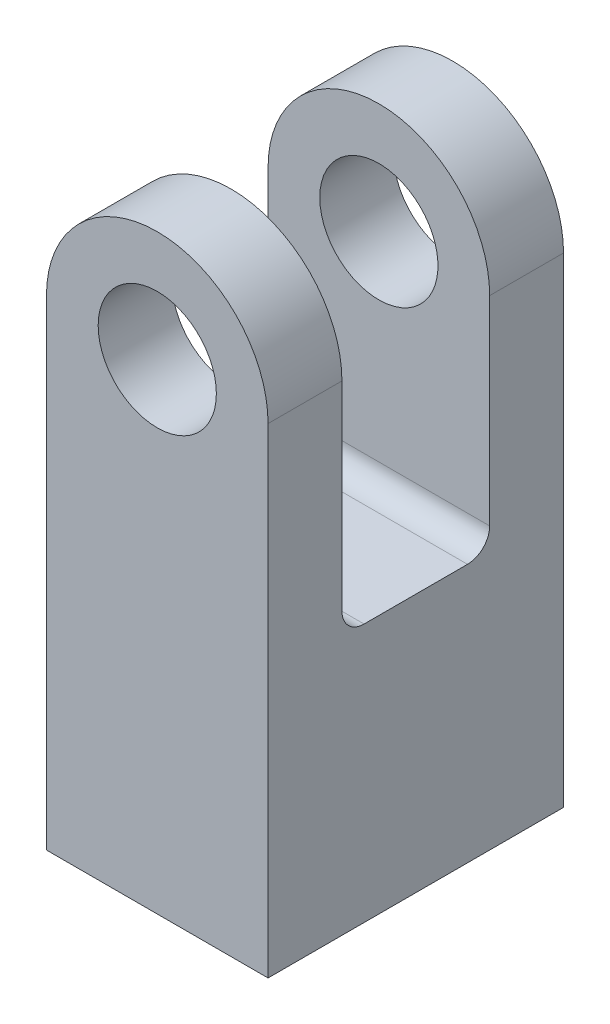
ISO-10303-21;
HEADER;
FILE_DESCRIPTION(('STEP AP214'),'2;1');
FILE_NAME('part.step','',(''),(''),'','','');
FILE_SCHEMA(('AUTOMOTIVE_DESIGN { 1 0 10303 214 1 1 1 1 }'));
ENDSEC;
DATA;
#1=APPLICATION_CONTEXT('core data for automotive mechanical design processes');
#2=APPLICATION_PROTOCOL_DEFINITION('international standard','automotive_design',2000,#1);
#3=PRODUCT_CONTEXT('',#1,'mechanical');
#4=PRODUCT('Part','Part','',(#3));
#5=PRODUCT_RELATED_PRODUCT_CATEGORY('part','',(#4));
#6=PRODUCT_DEFINITION_FORMATION('','',#4);
#7=PRODUCT_DEFINITION_CONTEXT('part definition',#1,'design');
#8=PRODUCT_DEFINITION('design','',#6,#7);
#9=PRODUCT_DEFINITION_SHAPE('','',#8);
#10=(LENGTH_UNIT() NAMED_UNIT(*) SI_UNIT(.MILLI.,.METRE.));
#11=(NAMED_UNIT(*) PLANE_ANGLE_UNIT() SI_UNIT($,.RADIAN.));
#12=(NAMED_UNIT(*) SI_UNIT($,.STERADIAN.) SOLID_ANGLE_UNIT());
#13=UNCERTAINTY_MEASURE_WITH_UNIT(LENGTH_MEASURE(1.E-05),#10,'distance_accuracy_value','');
#14=(GEOMETRIC_REPRESENTATION_CONTEXT(3) GLOBAL_UNCERTAINTY_ASSIGNED_CONTEXT((#13)) GLOBAL_UNIT_ASSIGNED_CONTEXT((#10,
#11,#12)) REPRESENTATION_CONTEXT('',''));
#15=CARTESIAN_POINT('',(0.,0.,0.));
#16=DIRECTION('',(0.,0.,1.));
#17=DIRECTION('',(1.,0.,0.));
#18=AXIS2_PLACEMENT_3D('',#15,#16,#17);
#19=CARTESIAN_POINT('',(15.,65.,40.));
#20=DIRECTION('',(0.,0.,-1.));
#21=DIRECTION('',(-1.,0.,0.));
#22=AXIS2_PLACEMENT_3D('',#19,#20,#21);
#23=CYLINDRICAL_SURFACE('',#22,15.);
#24=CARTESIAN_POINT('',(15.,65.,30.));
#25=DIRECTION('',(0.,0.,-1.));
#26=DIRECTION('',(-1.,0.,0.));
#27=AXIS2_PLACEMENT_3D('',#24,#25,#26);
#28=CIRCLE('',#27,15.);
#29=CARTESIAN_POINT('',(0.,65.,30.));
#30=VERTEX_POINT('',#29);
#31=CARTESIAN_POINT('',(30.,65.,30.));
#32=VERTEX_POINT('',#31);
#33=EDGE_CURVE('E114',#30,#32,#28,.T.);
#34=ORIENTED_EDGE('',*,*,#33,.F.);
#35=DIRECTION('',(0.,0.,-1.));
#36=VECTOR('',#35,1.);
#37=CARTESIAN_POINT('',(0.,65.,40.));
#38=LINE('',#37,#36);
#39=CARTESIAN_POINT('',(0.,65.,40.));
#40=VERTEX_POINT('',#39);
#41=EDGE_CURVE('E125',#40,#30,#38,.T.);
#42=ORIENTED_EDGE('',*,*,#41,.F.);
#43=CARTESIAN_POINT('',(15.,65.,40.));
#44=DIRECTION('',(0.,0.,1.));
#45=DIRECTION('',(1.,0.,0.));
#46=AXIS2_PLACEMENT_3D('',#43,#44,#45);
#47=CIRCLE('',#46,15.);
#48=CARTESIAN_POINT('',(30.,65.,40.));
#49=VERTEX_POINT('',#48);
#50=EDGE_CURVE('E140',#49,#40,#47,.T.);
#51=ORIENTED_EDGE('',*,*,#50,.F.);
#52=DIRECTION('',(0.,0.,-1.));
#53=VECTOR('',#52,1.);
#54=CARTESIAN_POINT('',(30.,65.,40.));
#55=LINE('',#54,#53);
#56=EDGE_CURVE('E128',#49,#32,#55,.T.);
#57=ORIENTED_EDGE('',*,*,#56,.T.);
#58=EDGE_LOOP('',(#34,#42,#51,#57));
#59=FACE_BOUND('',#58,.T.);
#60=ADVANCED_FACE('F33',(#59),#23,.T.);
#61=CARTESIAN_POINT('',(15.,65.,40.));
#62=DIRECTION('',(0.,0.,-1.));
#63=DIRECTION('',(-1.,0.,0.));
#64=AXIS2_PLACEMENT_3D('',#61,#62,#63);
#65=CYLINDRICAL_SURFACE('',#64,8.00000000000001);
#66=CARTESIAN_POINT('',(15.,65.,40.));
#67=DIRECTION('',(0.,0.,1.));
#68=DIRECTION('',(1.,0.,0.));
#69=AXIS2_PLACEMENT_3D('',#66,#67,#68);
#70=CIRCLE('',#69,8.00000000000001);
#71=CARTESIAN_POINT('',(23.,65.,40.));
#72=VERTEX_POINT('',#71);
#73=EDGE_CURVE('E193',#72,#72,#70,.T.);
#74=ORIENTED_EDGE('',*,*,#73,.T.);
#75=EDGE_LOOP('',(#74));
#76=FACE_BOUND('',#75,.T.);
#77=CARTESIAN_POINT('',(15.,65.,30.));
#78=DIRECTION('',(0.,0.,-1.));
#79=DIRECTION('',(-1.,0.,0.));
#80=AXIS2_PLACEMENT_3D('',#77,#78,#79);
#81=CIRCLE('',#80,8.00000000000001);
#82=CARTESIAN_POINT('',(6.99999999999999,65.,30.));
#83=VERTEX_POINT('',#82);
#84=EDGE_CURVE('E130',#83,#83,#81,.T.);
#85=ORIENTED_EDGE('',*,*,#84,.T.);
#86=EDGE_LOOP('',(#85));
#87=FACE_BOUND('',#86,.T.);
#88=ADVANCED_FACE('F236',(#76,#87),#65,.F.);
#89=CARTESIAN_POINT('',(15.,65.,40.));
#90=DIRECTION('',(0.,0.,1.));
#91=DIRECTION('',(1.,0.,0.));
#92=AXIS2_PLACEMENT_3D('',#89,#90,#91);
#93=PLANE('',#92);
#94=DIRECTION('',(0.,-1.,0.));
#95=VECTOR('',#94,1.);
#96=CARTESIAN_POINT('',(0.,65.,40.));
#97=LINE('',#96,#95);
#98=CARTESIAN_POINT('',(0.,0.,40.));
#99=VERTEX_POINT('',#98);
#100=EDGE_CURVE('E135',#40,#99,#97,.T.);
#101=ORIENTED_EDGE('',*,*,#100,.T.);
#102=DIRECTION('',(1.,0.,0.));
#103=VECTOR('',#102,1.);
#104=CARTESIAN_POINT('',(0.,0.,40.));
#105=LINE('',#104,#103);
#106=CARTESIAN_POINT('',(30.,0.,40.));
#107=VERTEX_POINT('',#106);
#108=EDGE_CURVE('E200',#99,#107,#105,.T.);
#109=ORIENTED_EDGE('',*,*,#108,.T.);
#110=DIRECTION('',(0.,1.,0.));
#111=VECTOR('',#110,1.);
#112=CARTESIAN_POINT('',(30.,0.,40.));
#113=LINE('',#112,#111);
#114=EDGE_CURVE('E202',#107,#49,#113,.T.);
#115=ORIENTED_EDGE('',*,*,#114,.T.);
#116=ORIENTED_EDGE('',*,*,#50,.T.);
#117=EDGE_LOOP('',(#101,#109,#115,#116));
#118=FACE_BOUND('',#117,.T.);
#119=ORIENTED_EDGE('',*,*,#73,.F.);
#120=EDGE_LOOP('',(#119));
#121=FACE_BOUND('',#120,.T.);
#122=ADVANCED_FACE('F224',(#118,#121),#93,.T.);
#123=CARTESIAN_POINT('',(15.,65.,0.));
#124=DIRECTION('',(0.,0.,1.));
#125=DIRECTION('',(1.,0.,0.));
#126=AXIS2_PLACEMENT_3D('',#123,#124,#125);
#127=PLANE('',#126);
#128=DIRECTION('',(0.,-1.,0.));
#129=VECTOR('',#128,1.);
#130=CARTESIAN_POINT('',(0.,65.,0.));
#131=LINE('',#130,#129);
#132=CARTESIAN_POINT('',(0.,65.,0.));
#133=VERTEX_POINT('',#132);
#134=CARTESIAN_POINT('',(0.,0.,0.));
#135=VERTEX_POINT('',#134);
#136=EDGE_CURVE('E196',#133,#135,#131,.T.);
#137=ORIENTED_EDGE('',*,*,#136,.F.);
#138=CARTESIAN_POINT('',(15.,65.,0.));
#139=DIRECTION('',(0.,0.,1.));
#140=DIRECTION('',(1.,0.,0.));
#141=AXIS2_PLACEMENT_3D('',#138,#139,#140);
#142=CIRCLE('',#141,15.);
#143=CARTESIAN_POINT('',(30.,65.,0.));
#144=VERTEX_POINT('',#143);
#145=EDGE_CURVE('E142',#144,#133,#142,.T.);
#146=ORIENTED_EDGE('',*,*,#145,.F.);
#147=DIRECTION('',(0.,1.,0.));
#148=VECTOR('',#147,1.);
#149=CARTESIAN_POINT('',(30.,0.,0.));
#150=LINE('',#149,#148);
#151=CARTESIAN_POINT('',(30.,0.,0.));
#152=VERTEX_POINT('',#151);
#153=EDGE_CURVE('E208',#152,#144,#150,.T.);
#154=ORIENTED_EDGE('',*,*,#153,.F.);
#155=DIRECTION('',(1.,0.,0.));
#156=VECTOR('',#155,1.);
#157=CARTESIAN_POINT('',(0.,0.,0.));
#158=LINE('',#157,#156);
#159=EDGE_CURVE('E207',#135,#152,#158,.T.);
#160=ORIENTED_EDGE('',*,*,#159,.F.);
#161=EDGE_LOOP('',(#137,#146,#154,#160));
#162=FACE_BOUND('',#161,.T.);
#163=CARTESIAN_POINT('',(15.,65.,0.));
#164=DIRECTION('',(0.,0.,1.));
#165=DIRECTION('',(1.,0.,0.));
#166=AXIS2_PLACEMENT_3D('',#163,#164,#165);
#167=CIRCLE('',#166,8.00000000000001);
#168=CARTESIAN_POINT('',(23.,65.,0.));
#169=VERTEX_POINT('',#168);
#170=EDGE_CURVE('E192',#169,#169,#167,.T.);
#171=ORIENTED_EDGE('',*,*,#170,.T.);
#172=EDGE_LOOP('',(#171));
#173=FACE_BOUND('',#172,.T.);
#174=ADVANCED_FACE('F217',(#162,#173),#127,.F.);
#175=CARTESIAN_POINT('',(0.,65.,40.));
#176=DIRECTION('',(1.,0.,0.));
#177=DIRECTION('',(0.,1.,0.));
#178=AXIS2_PLACEMENT_3D('',#175,#176,#177);
#179=PLANE('',#178);
#180=DIRECTION('',(0.,0.,1.));
#181=VECTOR('',#180,1.);
#182=CARTESIAN_POINT('',(0.,35.,10.));
#183=LINE('',#182,#181);
#184=CARTESIAN_POINT('',(0.,35.,13.));
#185=VERTEX_POINT('',#184);
#186=CARTESIAN_POINT('',(0.,35.,27.));
#187=VERTEX_POINT('',#186);
#188=EDGE_CURVE('E179',#185,#187,#183,.T.);
#189=ORIENTED_EDGE('',*,*,#188,.F.);
#190=CARTESIAN_POINT('',(0.,38.,13.));
#191=DIRECTION('',(1.,0.,0.));
#192=DIRECTION('',(0.,1.,0.));
#193=AXIS2_PLACEMENT_3D('',#190,#191,#192);
#194=CIRCLE('',#193,3.);
#195=CARTESIAN_POINT('',(0.,38.,10.));
#196=VERTEX_POINT('',#195);
#197=EDGE_CURVE('E11',#185,#196,#194,.T.);
#198=ORIENTED_EDGE('',*,*,#197,.T.);
#199=DIRECTION('',(0.,-1.,0.));
#200=VECTOR('',#199,1.);
#201=CARTESIAN_POINT('',(0.,35.,10.));
#202=LINE('',#201,#200);
#203=CARTESIAN_POINT('',(0.,65.,10.));
#204=VERTEX_POINT('',#203);
#205=EDGE_CURVE('E184',#204,#196,#202,.T.);
#206=ORIENTED_EDGE('',*,*,#205,.F.);
#207=EDGE_CURVE('E137',#204,#133,#38,.T.);
#208=ORIENTED_EDGE('',*,*,#207,.T.);
#209=ORIENTED_EDGE('',*,*,#136,.T.);
#210=DIRECTION('',(0.,0.,-1.));
#211=VECTOR('',#210,1.);
#212=CARTESIAN_POINT('',(0.,0.,40.));
#213=LINE('',#212,#211);
#214=EDGE_CURVE('E148',#99,#135,#213,.T.);
#215=ORIENTED_EDGE('',*,*,#214,.F.);
#216=ORIENTED_EDGE('',*,*,#100,.F.);
#217=ORIENTED_EDGE('',*,*,#41,.T.);
#218=DIRECTION('',(0.,-1.,0.));
#219=VECTOR('',#218,1.);
#220=CARTESIAN_POINT('',(0.,35.,30.));
#221=LINE('',#220,#219);
#222=CARTESIAN_POINT('',(0.,38.,30.));
#223=VERTEX_POINT('',#222);
#224=EDGE_CURVE('E110',#30,#223,#221,.T.);
#225=ORIENTED_EDGE('',*,*,#224,.T.);
#226=CARTESIAN_POINT('',(0.,38.,27.));
#227=DIRECTION('',(1.,0.,0.));
#228=DIRECTION('',(0.,1.,0.));
#229=AXIS2_PLACEMENT_3D('',#226,#227,#228);
#230=CIRCLE('',#229,3.);
#231=EDGE_CURVE('E167',#223,#187,#230,.T.);
#232=ORIENTED_EDGE('',*,*,#231,.T.);
#233=EDGE_LOOP('',(#189,#198,#206,#208,#209,#215,#216,#217,#225,#232));
#234=FACE_BOUND('',#233,.T.);
#235=ADVANCED_FACE('F132',(#234),#179,.F.);
#236=CARTESIAN_POINT('',(0.,0.,40.));
#237=DIRECTION('',(0.,1.,0.));
#238=DIRECTION('',(0.,0.,1.));
#239=AXIS2_PLACEMENT_3D('',#236,#237,#238);
#240=PLANE('',#239);
#241=ORIENTED_EDGE('',*,*,#159,.T.);
#242=DIRECTION('',(0.,0.,-1.));
#243=VECTOR('',#242,1.);
#244=CARTESIAN_POINT('',(30.,0.,40.));
#245=LINE('',#244,#243);
#246=EDGE_CURVE('E145',#107,#152,#245,.T.);
#247=ORIENTED_EDGE('',*,*,#246,.F.);
#248=ORIENTED_EDGE('',*,*,#108,.F.);
#249=ORIENTED_EDGE('',*,*,#214,.T.);
#250=EDGE_LOOP('',(#241,#247,#248,#249));
#251=FACE_BOUND('',#250,.T.);
#252=ADVANCED_FACE('F220',(#251),#240,.F.);
#253=CARTESIAN_POINT('',(30.,0.,40.));
#254=DIRECTION('',(-1.,0.,0.));
#255=DIRECTION('',(0.,0.,1.));
#256=AXIS2_PLACEMENT_3D('',#253,#254,#255);
#257=PLANE('',#256);
#258=CARTESIAN_POINT('',(30.,65.,10.));
#259=VERTEX_POINT('',#258);
#260=EDGE_CURVE('E136',#259,#144,#55,.T.);
#261=ORIENTED_EDGE('',*,*,#260,.F.);
#262=DIRECTION('',(0.,1.,0.));
#263=VECTOR('',#262,1.);
#264=CARTESIAN_POINT('',(30.,35.,10.));
#265=LINE('',#264,#263);
#266=CARTESIAN_POINT('',(30.,38.,10.));
#267=VERTEX_POINT('',#266);
#268=EDGE_CURVE('E174',#267,#259,#265,.T.);
#269=ORIENTED_EDGE('',*,*,#268,.F.);
#270=CARTESIAN_POINT('',(30.,38.,13.));
#271=DIRECTION('',(-1.,0.,0.));
#272=DIRECTION('',(0.,0.,1.));
#273=AXIS2_PLACEMENT_3D('',#270,#271,#272);
#274=CIRCLE('',#273,3.);
#275=CARTESIAN_POINT('',(30.,35.,13.));
#276=VERTEX_POINT('',#275);
#277=EDGE_CURVE('E41',#267,#276,#274,.T.);
#278=ORIENTED_EDGE('',*,*,#277,.T.);
#279=DIRECTION('',(0.,0.,1.));
#280=VECTOR('',#279,1.);
#281=CARTESIAN_POINT('',(30.,35.,10.));
#282=LINE('',#281,#280);
#283=CARTESIAN_POINT('',(30.,35.,27.));
#284=VERTEX_POINT('',#283);
#285=EDGE_CURVE('E154',#276,#284,#282,.T.);
#286=ORIENTED_EDGE('',*,*,#285,.T.);
#287=CARTESIAN_POINT('',(30.,38.,27.));
#288=DIRECTION('',(-1.,0.,0.));
#289=DIRECTION('',(0.,0.,1.));
#290=AXIS2_PLACEMENT_3D('',#287,#288,#289);
#291=CIRCLE('',#290,3.);
#292=CARTESIAN_POINT('',(30.,38.,30.));
#293=VERTEX_POINT('',#292);
#294=EDGE_CURVE('E165',#284,#293,#291,.T.);
#295=ORIENTED_EDGE('',*,*,#294,.T.);
#296=DIRECTION('',(0.,1.,0.));
#297=VECTOR('',#296,1.);
#298=CARTESIAN_POINT('',(30.,35.,30.));
#299=LINE('',#298,#297);
#300=EDGE_CURVE('E120',#293,#32,#299,.T.);
#301=ORIENTED_EDGE('',*,*,#300,.T.);
#302=ORIENTED_EDGE('',*,*,#56,.F.);
#303=ORIENTED_EDGE('',*,*,#114,.F.);
#304=ORIENTED_EDGE('',*,*,#246,.T.);
#305=ORIENTED_EDGE('',*,*,#153,.T.);
#306=EDGE_LOOP('',(#261,#269,#278,#286,#295,#301,#302,#303,#304,#305));
#307=FACE_BOUND('',#306,.T.);
#308=ADVANCED_FACE('F173',(#307),#257,.F.);
#309=ORIENTED_EDGE('',*,*,#207,.F.);
#310=CARTESIAN_POINT('',(15.,65.,10.));
#311=DIRECTION('',(0.,0.,-1.));
#312=DIRECTION('',(-1.,0.,0.));
#313=AXIS2_PLACEMENT_3D('',#310,#311,#312);
#314=CIRCLE('',#313,15.);
#315=EDGE_CURVE('E157',#204,#259,#314,.T.);
#316=ORIENTED_EDGE('',*,*,#315,.T.);
#317=ORIENTED_EDGE('',*,*,#260,.T.);
#318=ORIENTED_EDGE('',*,*,#145,.T.);
#319=EDGE_LOOP('',(#309,#316,#317,#318));
#320=FACE_BOUND('',#319,.T.);
#321=ADVANCED_FACE('F215',(#320),#23,.T.);
#322=CARTESIAN_POINT('',(15.,65.,10.));
#323=DIRECTION('',(0.,0.,-1.));
#324=DIRECTION('',(-1.,0.,0.));
#325=AXIS2_PLACEMENT_3D('',#322,#323,#324);
#326=CIRCLE('',#325,8.00000000000001);
#327=CARTESIAN_POINT('',(6.99999999999999,65.,10.));
#328=VERTEX_POINT('',#327);
#329=EDGE_CURVE('E129',#328,#328,#326,.T.);
#330=ORIENTED_EDGE('',*,*,#329,.F.);
#331=EDGE_LOOP('',(#330));
#332=FACE_BOUND('',#331,.T.);
#333=ORIENTED_EDGE('',*,*,#170,.F.);
#334=EDGE_LOOP('',(#333));
#335=FACE_BOUND('',#334,.T.);
#336=ADVANCED_FACE('F243',(#332,#335),#65,.F.);
#337=CARTESIAN_POINT('',(0.,0.,10.));
#338=DIRECTION('',(0.,0.,-1.));
#339=DIRECTION('',(-1.,0.,0.));
#340=AXIS2_PLACEMENT_3D('',#337,#338,#339);
#341=PLANE('',#340);
#342=ORIENTED_EDGE('',*,*,#329,.T.);
#343=EDGE_LOOP('',(#342));
#344=FACE_BOUND('',#343,.T.);
#345=ORIENTED_EDGE('',*,*,#205,.T.);
#346=DIRECTION('',(1.,0.,0.));
#347=VECTOR('',#346,1.);
#348=CARTESIAN_POINT('',(30.,38.,10.));
#349=LINE('',#348,#347);
#350=EDGE_CURVE('E163',#196,#267,#349,.T.);
#351=ORIENTED_EDGE('',*,*,#350,.T.);
#352=ORIENTED_EDGE('',*,*,#268,.T.);
#353=ORIENTED_EDGE('',*,*,#315,.F.);
#354=EDGE_LOOP('',(#345,#351,#352,#353));
#355=FACE_BOUND('',#354,.T.);
#356=ADVANCED_FACE('F182',(#344,#355),#341,.F.);
#357=CARTESIAN_POINT('',(0.,0.,30.));
#358=DIRECTION('',(0.,0.,-1.));
#359=DIRECTION('',(-1.,0.,0.));
#360=AXIS2_PLACEMENT_3D('',#357,#358,#359);
#361=PLANE('',#360);
#362=ORIENTED_EDGE('',*,*,#84,.F.);
#363=EDGE_LOOP('',(#362));
#364=FACE_BOUND('',#363,.T.);
#365=ORIENTED_EDGE('',*,*,#300,.F.);
#366=DIRECTION('',(1.,0.,0.));
#367=VECTOR('',#366,1.);
#368=CARTESIAN_POINT('',(0.,38.,30.));
#369=LINE('',#368,#367);
#370=EDGE_CURVE('E117',#293,#223,#369,.F.);
#371=ORIENTED_EDGE('',*,*,#370,.T.);
#372=ORIENTED_EDGE('',*,*,#224,.F.);
#373=ORIENTED_EDGE('',*,*,#33,.T.);
#374=EDGE_LOOP('',(#365,#371,#372,#373));
#375=FACE_BOUND('',#374,.T.);
#376=ADVANCED_FACE('F113',(#364,#375),#361,.T.);
#377=CARTESIAN_POINT('',(0.,35.,10.));
#378=DIRECTION('',(0.,-1.,0.));
#379=DIRECTION('',(0.,0.,-1.));
#380=AXIS2_PLACEMENT_3D('',#377,#378,#379);
#381=PLANE('',#380);
#382=ORIENTED_EDGE('',*,*,#188,.T.);
#383=DIRECTION('',(1.,0.,0.));
#384=VECTOR('',#383,1.);
#385=CARTESIAN_POINT('',(0.,35.,27.));
#386=LINE('',#385,#384);
#387=EDGE_CURVE('E159',#187,#284,#386,.T.);
#388=ORIENTED_EDGE('',*,*,#387,.T.);
#389=ORIENTED_EDGE('',*,*,#285,.F.);
#390=DIRECTION('',(1.,0.,0.));
#391=VECTOR('',#390,1.);
#392=CARTESIAN_POINT('',(0.,35.,13.));
#393=LINE('',#392,#391);
#394=EDGE_CURVE('E151',#276,#185,#393,.F.);
#395=ORIENTED_EDGE('',*,*,#394,.T.);
#396=EDGE_LOOP('',(#382,#388,#389,#395));
#397=FACE_BOUND('',#396,.T.);
#398=ADVANCED_FACE('F177',(#397),#381,.F.);
#399=CARTESIAN_POINT('',(0.,38.,27.));
#400=DIRECTION('',(1.,0.,0.));
#401=DIRECTION('',(0.,0.,-1.));
#402=AXIS2_PLACEMENT_3D('',#399,#400,#401);
#403=CYLINDRICAL_SURFACE('',#402,3.);
#404=ORIENTED_EDGE('',*,*,#231,.F.);
#405=ORIENTED_EDGE('',*,*,#370,.F.);
#406=ORIENTED_EDGE('',*,*,#294,.F.);
#407=ORIENTED_EDGE('',*,*,#387,.F.);
#408=EDGE_LOOP('',(#404,#405,#406,#407));
#409=FACE_BOUND('',#408,.T.);
#410=ADVANCED_FACE('F227',(#409),#403,.F.);
#411=CARTESIAN_POINT('',(0.,38.,13.));
#412=DIRECTION('',(-1.,0.,0.));
#413=DIRECTION('',(0.,0.,1.));
#414=AXIS2_PLACEMENT_3D('',#411,#412,#413);
#415=CYLINDRICAL_SURFACE('',#414,3.);
#416=ORIENTED_EDGE('',*,*,#197,.F.);
#417=ORIENTED_EDGE('',*,*,#394,.F.);
#418=ORIENTED_EDGE('',*,*,#277,.F.);
#419=ORIENTED_EDGE('',*,*,#350,.F.);
#420=EDGE_LOOP('',(#416,#417,#418,#419));
#421=FACE_BOUND('',#420,.T.);
#422=ADVANCED_FACE('F35',(#421),#415,.F.);
#423=CLOSED_SHELL('',(#60,#88,#122,#174,#235,#252,#308,#321,#336,#356,#376,#398,#410,#422));
#424=MANIFOLD_SOLID_BREP('B2',#423);
#425=ADVANCED_BREP_SHAPE_REPRESENTATION('',(#18,#424),#14);
#426=SHAPE_DEFINITION_REPRESENTATION(#9,#425);
ENDSEC;
END-ISO-10303-21;
